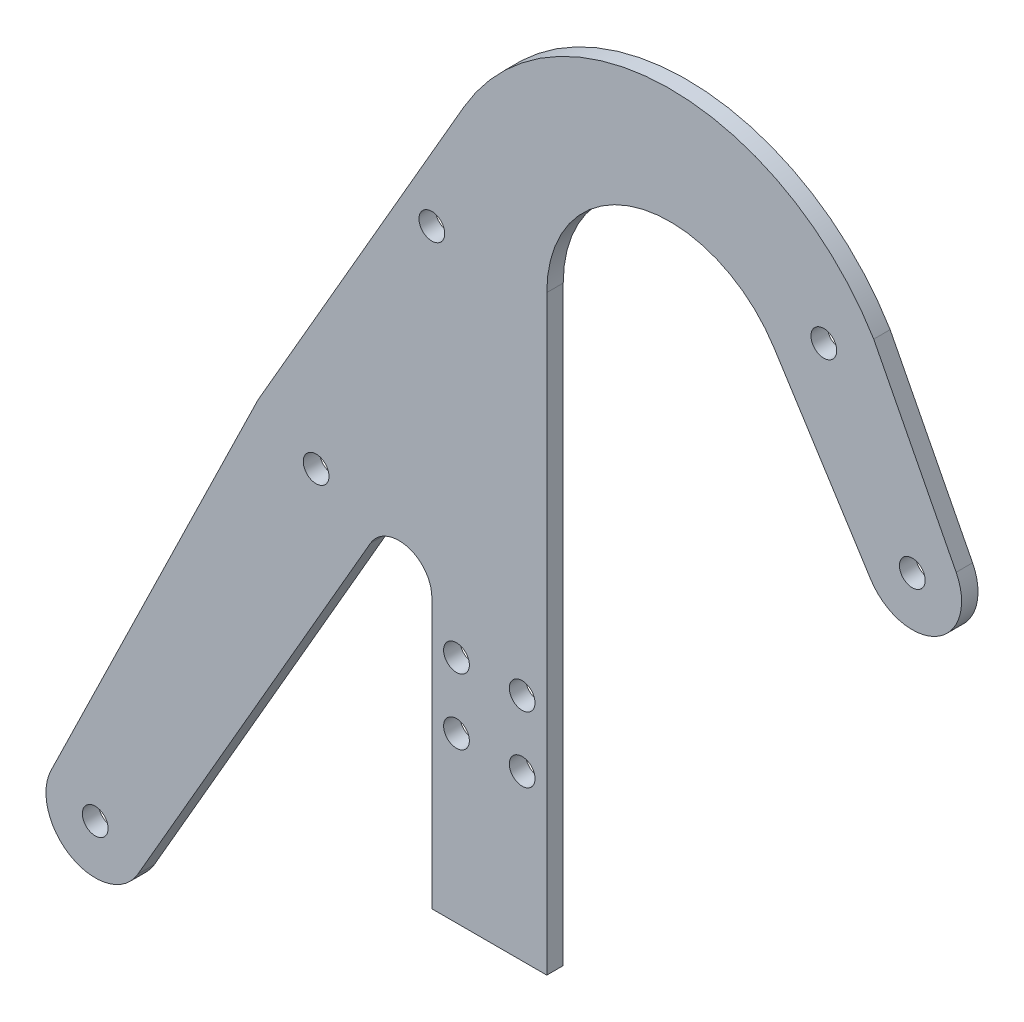
ISO-10303-21;
HEADER;
FILE_DESCRIPTION(('STEP AP214'),'2;1');
FILE_NAME('part.step','',(''),(''),'','','');
FILE_SCHEMA(('AUTOMOTIVE_DESIGN { 1 0 10303 214 1 1 1 1 }'));
ENDSEC;
DATA;
#1=APPLICATION_CONTEXT('core data for automotive mechanical design processes');
#2=APPLICATION_PROTOCOL_DEFINITION('international standard','automotive_design',2000,#1);
#3=PRODUCT_CONTEXT('',#1,'mechanical');
#4=PRODUCT('Part','Part','',(#3));
#5=PRODUCT_RELATED_PRODUCT_CATEGORY('part','',(#4));
#6=PRODUCT_DEFINITION_FORMATION('','',#4);
#7=PRODUCT_DEFINITION_CONTEXT('part definition',#1,'design');
#8=PRODUCT_DEFINITION('design','',#6,#7);
#9=PRODUCT_DEFINITION_SHAPE('','',#8);
#10=(LENGTH_UNIT() NAMED_UNIT(*) SI_UNIT(.MILLI.,.METRE.));
#11=(NAMED_UNIT(*) PLANE_ANGLE_UNIT() SI_UNIT($,.RADIAN.));
#12=(NAMED_UNIT(*) SI_UNIT($,.STERADIAN.) SOLID_ANGLE_UNIT());
#13=UNCERTAINTY_MEASURE_WITH_UNIT(LENGTH_MEASURE(1.E-05),#10,'distance_accuracy_value','');
#14=(GEOMETRIC_REPRESENTATION_CONTEXT(3) GLOBAL_UNCERTAINTY_ASSIGNED_CONTEXT((#13)) GLOBAL_UNIT_ASSIGNED_CONTEXT((#10,
#11,#12)) REPRESENTATION_CONTEXT('',''));
#15=CARTESIAN_POINT('',(0.,0.,0.));
#16=DIRECTION('',(0.,0.,1.));
#17=DIRECTION('',(1.,0.,0.));
#18=AXIS2_PLACEMENT_3D('',#15,#16,#17);
#19=CARTESIAN_POINT('',(-399.047531915002,194.628485701719,-3.175));
#20=DIRECTION('',(-0.89879404629917,0.438371146789071,0.));
#21=DIRECTION('',(-0.438371146789071,-0.89879404629917,0.));
#22=AXIS2_PLACEMENT_3D('',#19,#20,#21);
#23=PLANE('',#22);
#24=DIRECTION('',(-0.438371146789071,-0.89879404629917,0.));
#25=VECTOR('',#24,1.);
#26=CARTESIAN_POINT('',(-399.047531915002,194.628485701719,0.));
#27=LINE('',#26,#25);
#28=CARTESIAN_POINT('',(-19.5042629583881,972.807508089043,0.));
#29=VERTEX_POINT('',#28);
#30=CARTESIAN_POINT('',(-59.3610132909995,891.089059769221,0.));
#31=VERTEX_POINT('',#30);
#32=EDGE_CURVE('E225',#29,#31,#27,.T.);
#33=ORIENTED_EDGE('',*,*,#32,.F.);
#34=DIRECTION('',(0.,0.,1.));
#35=VECTOR('',#34,1.);
#36=CARTESIAN_POINT('',(-19.5042629583881,972.807508089043,-3.175));
#37=LINE('',#36,#35);
#38=CARTESIAN_POINT('',(-19.5042629583881,972.807508089043,-3.175));
#39=VERTEX_POINT('',#38);
#40=EDGE_CURVE('E164',#39,#29,#37,.T.);
#41=ORIENTED_EDGE('',*,*,#40,.F.);
#42=DIRECTION('',(-0.438371146789071,-0.89879404629917,0.));
#43=VECTOR('',#42,1.);
#44=CARTESIAN_POINT('',(-399.047531915002,194.628485701719,-3.175));
#45=LINE('',#44,#43);
#46=CARTESIAN_POINT('',(-59.3610132909995,891.089059769221,-3.175));
#47=VERTEX_POINT('',#46);
#48=EDGE_CURVE('E158',#39,#47,#45,.T.);
#49=ORIENTED_EDGE('',*,*,#48,.T.);
#50=DIRECTION('',(0.,0.,1.));
#51=VECTOR('',#50,1.);
#52=CARTESIAN_POINT('',(-59.3610132909995,891.089059769221,-3.175));
#53=LINE('',#52,#51);
#54=EDGE_CURVE('E140',#47,#31,#53,.T.);
#55=ORIENTED_EDGE('',*,*,#54,.T.);
#56=EDGE_LOOP('',(#33,#41,#49,#55));
#57=FACE_BOUND('',#56,.T.);
#58=ADVANCED_FACE('F39',(#57),#23,.T.);
#59=CARTESIAN_POINT('',(-8.08957857038857,967.240194524822,-3.175));
#60=DIRECTION('',(0.,0.,1.));
#61=DIRECTION('',(1.,0.,0.));
#62=AXIS2_PLACEMENT_3D('',#59,#60,#61);
#63=CYLINDRICAL_SURFACE('',#62,12.7000000000001);
#64=CARTESIAN_POINT('',(-8.08957857038857,967.240194524822,0.));
#65=DIRECTION('',(0.,0.,1.));
#66=DIRECTION('',(1.,0.,0.));
#67=AXIS2_PLACEMENT_3D('',#64,#65,#66);
#68=CIRCLE('',#67,12.7000000000001);
#69=CARTESIAN_POINT('',(-19.088101198451,973.590194524821,0.));
#70=VERTEX_POINT('',#69);
#71=EDGE_CURVE('E256',#70,#29,#68,.T.);
#72=ORIENTED_EDGE('',*,*,#71,.F.);
#73=DIRECTION('',(0.,0.,1.));
#74=VECTOR('',#73,1.);
#75=CARTESIAN_POINT('',(-19.088101198451,973.590194524821,-3.175));
#76=LINE('',#75,#74);
#77=CARTESIAN_POINT('',(-19.088101198451,973.590194524821,-3.175));
#78=VERTEX_POINT('',#77);
#79=EDGE_CURVE('E262',#78,#70,#76,.T.);
#80=ORIENTED_EDGE('',*,*,#79,.F.);
#81=CARTESIAN_POINT('',(-8.08957857038857,967.240194524822,-3.175));
#82=DIRECTION('',(0.,0.,1.));
#83=DIRECTION('',(1.,0.,0.));
#84=AXIS2_PLACEMENT_3D('',#81,#82,#83);
#85=CIRCLE('',#84,12.7000000000001);
#86=EDGE_CURVE('E152',#78,#39,#85,.T.);
#87=ORIENTED_EDGE('',*,*,#86,.T.);
#88=ORIENTED_EDGE('',*,*,#40,.T.);
#89=EDGE_LOOP('',(#72,#80,#87,#88));
#90=FACE_BOUND('',#89,.T.);
#91=ADVANCED_FACE('F292',(#90),#63,.T.);
#92=CARTESIAN_POINT('',(-435.8929965658,251.662938905133,-3.175));
#93=DIRECTION('',(-0.866025403784442,0.499999999999995,0.));
#94=DIRECTION('',(-0.499999999999995,-0.866025403784442,0.));
#95=AXIS2_PLACEMENT_3D('',#92,#93,#94);
#96=PLANE('',#95);
#97=DIRECTION('',(-0.499999999999995,-0.866025403784442,0.));
#98=VECTOR('',#97,1.);
#99=CARTESIAN_POINT('',(-435.8929965658,251.662938905133,0.));
#100=LINE('',#99,#98);
#101=CARTESIAN_POINT('',(20.4553554732739,1042.08147058715,0.));
#102=VERTEX_POINT('',#101);
#103=EDGE_CURVE('E253',#102,#70,#100,.T.);
#104=ORIENTED_EDGE('',*,*,#103,.F.);
#105=DIRECTION('',(0.,0.,1.));
#106=VECTOR('',#105,1.);
#107=CARTESIAN_POINT('',(20.4553554732739,1042.08147058715,-3.175));
#108=LINE('',#107,#106);
#109=CARTESIAN_POINT('',(20.4553554732739,1042.08147058715,-3.175));
#110=VERTEX_POINT('',#109);
#111=EDGE_CURVE('E264',#110,#102,#108,.T.);
#112=ORIENTED_EDGE('',*,*,#111,.F.);
#113=DIRECTION('',(-0.499999999999995,-0.866025403784442,0.));
#114=VECTOR('',#113,1.);
#115=CARTESIAN_POINT('',(-435.8929965658,251.662938905133,-3.175));
#116=LINE('',#115,#114);
#117=EDGE_CURVE('E194',#110,#78,#116,.T.);
#118=ORIENTED_EDGE('',*,*,#117,.T.);
#119=ORIENTED_EDGE('',*,*,#79,.T.);
#120=EDGE_LOOP('',(#104,#112,#118,#119));
#121=FACE_BOUND('',#120,.T.);
#122=ADVANCED_FACE('F335',(#121),#96,.T.);
#123=CARTESIAN_POINT('',(60.3250000000002,1019.06272058715,-3.175));
#124=DIRECTION('',(0.,0.,1.));
#125=DIRECTION('',(1.,0.,0.));
#126=AXIS2_PLACEMENT_3D('',#123,#124,#125);
#127=CYLINDRICAL_SURFACE('',#126,46.0375000000001);
#128=CARTESIAN_POINT('',(60.3250000000002,1019.06272058715,0.));
#129=DIRECTION('',(0.,0.,1.));
#130=DIRECTION('',(1.,0.,0.));
#131=AXIS2_PLACEMENT_3D('',#128,#129,#130);
#132=CIRCLE('',#131,46.0375000000001);
#133=CARTESIAN_POINT('',(99.7257138260212,1042.87522058715,0.));
#134=VERTEX_POINT('',#133);
#135=EDGE_CURVE('E250',#134,#102,#132,.T.);
#136=ORIENTED_EDGE('',*,*,#135,.F.);
#137=DIRECTION('',(0.,0.,1.));
#138=VECTOR('',#137,1.);
#139=CARTESIAN_POINT('',(99.7257138260212,1042.87522058715,-3.175));
#140=LINE('',#139,#138);
#141=CARTESIAN_POINT('',(99.7257138260212,1042.87522058715,-3.175));
#142=VERTEX_POINT('',#141);
#143=EDGE_CURVE('E266',#142,#134,#140,.T.);
#144=ORIENTED_EDGE('',*,*,#143,.F.);
#145=CARTESIAN_POINT('',(60.3250000000002,1019.06272058715,-3.175));
#146=DIRECTION('',(0.,0.,1.));
#147=DIRECTION('',(1.,0.,0.));
#148=AXIS2_PLACEMENT_3D('',#145,#146,#147);
#149=CIRCLE('',#148,46.0375000000001);
#150=EDGE_CURVE('E191',#142,#110,#149,.T.);
#151=ORIENTED_EDGE('',*,*,#150,.T.);
#152=ORIENTED_EDGE('',*,*,#111,.T.);
#153=EDGE_LOOP('',(#136,#144,#151,#152));
#154=FACE_BOUND('',#153,.T.);
#155=ADVANCED_FACE('F298',(#154),#127,.T.);
#156=CARTESIAN_POINT('',(502.455000504294,257.725954336452,-3.175));
#157=DIRECTION('',(-0.889776673115529,-0.456396178752037,0.));
#158=DIRECTION('',(0.456396178752037,-0.889776673115529,0.));
#159=AXIS2_PLACEMENT_3D('',#156,#157,#158);
#160=PLANE('',#159);
#161=DIRECTION('',(0.456396178752037,-0.889776673115529,0.));
#162=VECTOR('',#161,1.);
#163=CARTESIAN_POINT('',(502.455000504294,257.725954336452,0.));
#164=LINE('',#163,#162);
#165=CARTESIAN_POINT('',(115.665350368936,1011.79977027859,0.));
#166=VERTEX_POINT('',#165);
#167=EDGE_CURVE('E247',#134,#166,#164,.T.);
#168=ORIENTED_EDGE('',*,*,#167,.T.);
#169=DIRECTION('',(0.,0.,1.));
#170=VECTOR('',#169,1.);
#171=CARTESIAN_POINT('',(115.665350368936,1011.79977027859,-3.175));
#172=LINE('',#171,#170);
#173=CARTESIAN_POINT('',(115.665350368936,1011.79977027859,-3.175));
#174=VERTEX_POINT('',#173);
#175=EDGE_CURVE('E268',#174,#166,#172,.T.);
#176=ORIENTED_EDGE('',*,*,#175,.F.);
#177=DIRECTION('',(0.456396178752037,-0.889776673115529,0.));
#178=VECTOR('',#177,1.);
#179=CARTESIAN_POINT('',(502.455000504294,257.725954336452,-3.175));
#180=LINE('',#179,#178);
#181=EDGE_CURVE('E189',#142,#174,#180,.T.);
#182=ORIENTED_EDGE('',*,*,#181,.F.);
#183=ORIENTED_EDGE('',*,*,#143,.T.);
#184=EDGE_LOOP('',(#168,#176,#182,#183));
#185=FACE_BOUND('',#184,.T.);
#186=ADVANCED_FACE('F303',(#185),#160,.F.);
#187=CARTESIAN_POINT('',(107.190227557511,1007.45259667598,-3.175));
#188=DIRECTION('',(0.,0.,1.));
#189=DIRECTION('',(1.,0.,0.));
#190=AXIS2_PLACEMENT_3D('',#187,#188,#189);
#191=CYLINDRICAL_SURFACE('',#190,9.52500000000022);
#192=CARTESIAN_POINT('',(107.190227557511,1007.45259667598,0.));
#193=DIRECTION('',(0.,0.,1.));
#194=DIRECTION('',(1.,0.,0.));
#195=AXIS2_PLACEMENT_3D('',#192,#193,#194);
#196=CIRCLE('',#195,9.52500000000022);
#197=CARTESIAN_POINT('',(99.1496275266768,1002.34628918972,0.));
#198=VERTEX_POINT('',#197);
#199=EDGE_CURVE('E244',#198,#166,#196,.T.);
#200=ORIENTED_EDGE('',*,*,#199,.F.);
#201=DIRECTION('',(0.,0.,1.));
#202=VECTOR('',#201,1.);
#203=CARTESIAN_POINT('',(99.1496275266768,1002.34628918972,-3.175));
#204=LINE('',#203,#202);
#205=CARTESIAN_POINT('',(99.1496275266768,1002.34628918972,-3.175));
#206=VERTEX_POINT('',#205);
#207=EDGE_CURVE('E270',#206,#198,#204,.T.);
#208=ORIENTED_EDGE('',*,*,#207,.F.);
#209=CARTESIAN_POINT('',(107.190227557511,1007.45259667598,-3.175));
#210=DIRECTION('',(0.,0.,1.));
#211=DIRECTION('',(1.,0.,0.));
#212=AXIS2_PLACEMENT_3D('',#209,#210,#211);
#213=CIRCLE('',#212,9.52500000000022);
#214=EDGE_CURVE('E186',#206,#174,#213,.T.);
#215=ORIENTED_EDGE('',*,*,#214,.T.);
#216=ORIENTED_EDGE('',*,*,#175,.T.);
#217=EDGE_LOOP('',(#200,#208,#215,#216));
#218=FACE_BOUND('',#217,.T.);
#219=ADVANCED_FACE('F442',(#218),#191,.T.);
#220=CARTESIAN_POINT('',(524.264856713745,332.942510801512,-3.175));
#221=DIRECTION('',(-0.84415748355209,-0.536095274147239,0.));
#222=DIRECTION('',(0.536095274147239,-0.84415748355209,0.));
#223=AXIS2_PLACEMENT_3D('',#220,#221,#222);
#224=PLANE('',#223);
#225=DIRECTION('',(0.536095274147239,-0.84415748355209,0.));
#226=VECTOR('',#225,1.);
#227=CARTESIAN_POINT('',(524.264856713745,332.942510801512,0.));
#228=LINE('',#227,#226);
#229=CARTESIAN_POINT('',(80.4265000770844,1031.82848930278,0.));
#230=VERTEX_POINT('',#229);
#231=EDGE_CURVE('E241',#230,#198,#228,.T.);
#232=ORIENTED_EDGE('',*,*,#231,.F.);
#233=DIRECTION('',(0.,0.,1.));
#234=VECTOR('',#233,1.);
#235=CARTESIAN_POINT('',(80.4265000770844,1031.82848930278,-3.175));
#236=LINE('',#235,#234);
#237=CARTESIAN_POINT('',(80.4265000770844,1031.82848930278,-3.175));
#238=VERTEX_POINT('',#237);
#239=EDGE_CURVE('E272',#238,#230,#236,.T.);
#240=ORIENTED_EDGE('',*,*,#239,.F.);
#241=DIRECTION('',(0.536095274147239,-0.84415748355209,0.));
#242=VECTOR('',#241,1.);
#243=CARTESIAN_POINT('',(524.264856713745,332.942510801512,-3.175));
#244=LINE('',#243,#242);
#245=EDGE_CURVE('E183',#238,#206,#244,.T.);
#246=ORIENTED_EDGE('',*,*,#245,.T.);
#247=ORIENTED_EDGE('',*,*,#207,.T.);
#248=EDGE_LOOP('',(#232,#240,#246,#247));
#249=FACE_BOUND('',#248,.T.);
#250=ADVANCED_FACE('F309',(#249),#224,.T.);
#251=CARTESIAN_POINT('',(60.3250000000002,1019.06272058715,-3.175));
#252=DIRECTION('',(0.,0.,1.));
#253=DIRECTION('',(1.,0.,0.));
#254=AXIS2_PLACEMENT_3D('',#251,#252,#253);
#255=CYLINDRICAL_SURFACE('',#254,23.8125);
#256=CARTESIAN_POINT('',(60.3250000000002,1019.06272058715,0.));
#257=DIRECTION('',(0.,0.,1.));
#258=DIRECTION('',(1.,0.,0.));
#259=AXIS2_PLACEMENT_3D('',#256,#257,#258);
#260=CIRCLE('',#259,23.8125);
#261=CARTESIAN_POINT('',(36.5125000000002,1019.06272058715,0.));
#262=VERTEX_POINT('',#261);
#263=EDGE_CURVE('E238',#230,#262,#260,.T.);
#264=ORIENTED_EDGE('',*,*,#263,.T.);
#265=DIRECTION('',(0.,0.,1.));
#266=VECTOR('',#265,1.);
#267=CARTESIAN_POINT('',(36.5125000000002,1019.06272058715,-3.175));
#268=LINE('',#267,#266);
#269=CARTESIAN_POINT('',(36.5125000000002,1019.06272058715,-3.175));
#270=VERTEX_POINT('',#269);
#271=EDGE_CURVE('E274',#270,#262,#268,.T.);
#272=ORIENTED_EDGE('',*,*,#271,.F.);
#273=CARTESIAN_POINT('',(60.3250000000002,1019.06272058715,-3.175));
#274=DIRECTION('',(0.,0.,1.));
#275=DIRECTION('',(1.,0.,0.));
#276=AXIS2_PLACEMENT_3D('',#273,#274,#275);
#277=CIRCLE('',#276,23.8125);
#278=EDGE_CURVE('E181',#238,#270,#277,.T.);
#279=ORIENTED_EDGE('',*,*,#278,.F.);
#280=ORIENTED_EDGE('',*,*,#239,.T.);
#281=EDGE_LOOP('',(#264,#272,#279,#280));
#282=FACE_BOUND('',#281,.T.);
#283=ADVANCED_FACE('F315',(#282),#255,.F.);
#284=CARTESIAN_POINT('',(36.5124999999994,0.,-3.175));
#285=DIRECTION('',(1.,0.,0.));
#286=DIRECTION('',(0.,1.,0.));
#287=AXIS2_PLACEMENT_3D('',#284,#285,#286);
#288=PLANE('',#287);
#289=DIRECTION('',(0.,1.,0.));
#290=VECTOR('',#289,1.);
#291=CARTESIAN_POINT('',(36.5124999999994,0.,0.));
#292=LINE('',#291,#290);
#293=CARTESIAN_POINT('',(36.5125000000001,904.762720587149,0.));
#294=VERTEX_POINT('',#293);
#295=EDGE_CURVE('E235',#294,#262,#292,.T.);
#296=ORIENTED_EDGE('',*,*,#295,.F.);
#297=DIRECTION('',(0.,0.,1.));
#298=VECTOR('',#297,1.);
#299=CARTESIAN_POINT('',(36.5125000000001,904.762720587149,-3.175));
#300=LINE('',#299,#298);
#301=CARTESIAN_POINT('',(36.5125000000001,904.762720587149,-3.175));
#302=VERTEX_POINT('',#301);
#303=EDGE_CURVE('E276',#302,#294,#300,.T.);
#304=ORIENTED_EDGE('',*,*,#303,.F.);
#305=DIRECTION('',(0.,1.,0.));
#306=VECTOR('',#305,1.);
#307=CARTESIAN_POINT('',(36.5124999999994,0.,-3.175));
#308=LINE('',#307,#306);
#309=EDGE_CURVE('E178',#302,#270,#308,.T.);
#310=ORIENTED_EDGE('',*,*,#309,.T.);
#311=ORIENTED_EDGE('',*,*,#271,.T.);
#312=EDGE_LOOP('',(#296,#304,#310,#311));
#313=FACE_BOUND('',#312,.T.);
#314=ADVANCED_FACE('F449',(#313),#288,.T.);
#315=CARTESIAN_POINT('',(0.,904.762720587149,-3.175));
#316=DIRECTION('',(0.,-1.,0.));
#317=DIRECTION('',(0.,0.,-1.));
#318=AXIS2_PLACEMENT_3D('',#315,#316,#317);
#319=PLANE('',#318);
#320=DIRECTION('',(1.,0.,0.));
#321=VECTOR('',#320,1.);
#322=CARTESIAN_POINT('',(0.,904.762720587149,0.));
#323=LINE('',#322,#321);
#324=CARTESIAN_POINT('',(14.2875000000001,904.762720587149,0.));
#325=VERTEX_POINT('',#324);
#326=EDGE_CURVE('E232',#325,#294,#323,.T.);
#327=ORIENTED_EDGE('',*,*,#326,.F.);
#328=DIRECTION('',(0.,0.,1.));
#329=VECTOR('',#328,1.);
#330=CARTESIAN_POINT('',(14.2875000000001,904.762720587149,-3.175));
#331=LINE('',#330,#329);
#332=CARTESIAN_POINT('',(14.2875000000001,904.762720587149,-3.175));
#333=VERTEX_POINT('',#332);
#334=EDGE_CURVE('E278',#333,#325,#331,.T.);
#335=ORIENTED_EDGE('',*,*,#334,.F.);
#336=DIRECTION('',(1.,0.,0.));
#337=VECTOR('',#336,1.);
#338=CARTESIAN_POINT('',(0.,904.762720587149,-3.175));
#339=LINE('',#338,#337);
#340=EDGE_CURVE('E175',#333,#302,#339,.T.);
#341=ORIENTED_EDGE('',*,*,#340,.T.);
#342=ORIENTED_EDGE('',*,*,#303,.T.);
#343=EDGE_LOOP('',(#327,#335,#341,#342));
#344=FACE_BOUND('',#343,.T.);
#345=ADVANCED_FACE('F321',(#344),#319,.T.);
#346=CARTESIAN_POINT('',(14.2875000000001,0.,-3.175));
#347=DIRECTION('',(1.,0.,0.));
#348=DIRECTION('',(0.,0.,-1.));
#349=AXIS2_PLACEMENT_3D('',#346,#347,#348);
#350=PLANE('',#349);
#351=DIRECTION('',(0.,1.,0.));
#352=VECTOR('',#351,1.);
#353=CARTESIAN_POINT('',(14.2875000000001,0.,0.));
#354=LINE('',#353,#352);
#355=CARTESIAN_POINT('',(14.2875000000001,956.899908905633,0.));
#356=VERTEX_POINT('',#355);
#357=EDGE_CURVE('E230',#325,#356,#354,.T.);
#358=ORIENTED_EDGE('',*,*,#357,.T.);
#359=DIRECTION('',(0.,0.,1.));
#360=VECTOR('',#359,1.);
#361=CARTESIAN_POINT('',(14.2875000000001,956.899908905633,-3.175));
#362=LINE('',#361,#360);
#363=CARTESIAN_POINT('',(14.2875000000001,956.899908905633,-3.175));
#364=VERTEX_POINT('',#363);
#365=EDGE_CURVE('E54',#356,#364,#362,.F.);
#366=ORIENTED_EDGE('',*,*,#365,.T.);
#367=DIRECTION('',(0.,1.,0.));
#368=VECTOR('',#367,1.);
#369=CARTESIAN_POINT('',(14.2875000000001,0.,-3.175));
#370=LINE('',#369,#368);
#371=EDGE_CURVE('E173',#333,#364,#370,.T.);
#372=ORIENTED_EDGE('',*,*,#371,.F.);
#373=ORIENTED_EDGE('',*,*,#334,.T.);
#374=EDGE_LOOP('',(#358,#366,#372,#373));
#375=FACE_BOUND('',#374,.T.);
#376=ADVANCED_FACE('F323',(#375),#350,.F.);
#377=CARTESIAN_POINT('',(-413.895951309675,238.962938905133,-3.175));
#378=DIRECTION('',(-0.866025403784442,0.499999999999994,0.));
#379=DIRECTION('',(-0.499999999999995,-0.866025403784442,0.));
#380=AXIS2_PLACEMENT_3D('',#377,#378,#379);
#381=PLANE('',#380);
#382=DIRECTION('',(-0.499999999999994,-0.866025403784442,0.));
#383=VECTOR('',#382,1.);
#384=CARTESIAN_POINT('',(-413.895951309675,238.962938905133,-3.175));
#385=LINE('',#384,#383);
#386=CARTESIAN_POINT('',(2.43823868596887,960.074908905633,-3.175));
#387=VERTEX_POINT('',#386);
#388=CARTESIAN_POINT('',(-42.551108028953,882.151074596055,-3.175));
#389=VERTEX_POINT('',#388);
#390=EDGE_CURVE('E161',#387,#389,#385,.T.);
#391=ORIENTED_EDGE('',*,*,#390,.F.);
#392=DIRECTION('',(0.,0.,1.));
#393=VECTOR('',#392,1.);
#394=CARTESIAN_POINT('',(2.43823868596882,960.074908905633,0.));
#395=LINE('',#394,#393);
#396=CARTESIAN_POINT('',(2.43823868596887,960.074908905633,0.));
#397=VERTEX_POINT('',#396);
#398=EDGE_CURVE('E261',#387,#397,#395,.T.);
#399=ORIENTED_EDGE('',*,*,#398,.T.);
#400=DIRECTION('',(-0.499999999999994,-0.866025403784442,0.));
#401=VECTOR('',#400,1.);
#402=CARTESIAN_POINT('',(-413.895951309675,238.962938905133,0.));
#403=LINE('',#402,#401);
#404=CARTESIAN_POINT('',(-42.551108028953,882.151074596055,0.));
#405=VERTEX_POINT('',#404);
#406=EDGE_CURVE('E228',#397,#405,#403,.T.);
#407=ORIENTED_EDGE('',*,*,#406,.T.);
#408=DIRECTION('',(0.,0.,1.));
#409=VECTOR('',#408,1.);
#410=CARTESIAN_POINT('',(-42.551108028953,882.151074596055,-3.175));
#411=LINE('',#410,#409);
#412=EDGE_CURVE('E151',#389,#405,#411,.T.);
#413=ORIENTED_EDGE('',*,*,#412,.F.);
#414=EDGE_LOOP('',(#391,#399,#407,#413));
#415=FACE_BOUND('',#414,.T.);
#416=ADVANCED_FACE('F285',(#415),#381,.F.);
#417=CARTESIAN_POINT('',(-8.08957857038857,967.240194524822,-3.175));
#418=DIRECTION('',(0.,0.,1.));
#419=DIRECTION('',(1.,0.,0.));
#420=AXIS2_PLACEMENT_3D('',#417,#418,#419);
#421=CYLINDRICAL_SURFACE('',#420,2.48919999999975);
#422=CARTESIAN_POINT('',(-8.08957857038857,967.240194524822,-3.175));
#423=DIRECTION('',(0.,0.,1.));
#424=DIRECTION('',(1.,0.,0.));
#425=AXIS2_PLACEMENT_3D('',#422,#423,#424);
#426=CIRCLE('',#425,2.48919999999975);
#427=CARTESIAN_POINT('',(-5.60037857038882,967.240194524822,-3.175));
#428=VERTEX_POINT('',#427);
#429=EDGE_CURVE('E165',#428,#428,#426,.T.);
#430=ORIENTED_EDGE('',*,*,#429,.F.);
#431=EDGE_LOOP('',(#430));
#432=FACE_BOUND('',#431,.T.);
#433=CARTESIAN_POINT('',(-8.08957857038857,967.240194524822,0.));
#434=DIRECTION('',(0.,0.,1.));
#435=DIRECTION('',(1.,0.,0.));
#436=AXIS2_PLACEMENT_3D('',#433,#434,#435);
#437=CIRCLE('',#436,2.48919999999975);
#438=CARTESIAN_POINT('',(-5.60037857038882,967.240194524822,0.));
#439=VERTEX_POINT('',#438);
#440=EDGE_CURVE('E222',#439,#439,#437,.T.);
#441=ORIENTED_EDGE('',*,*,#440,.T.);
#442=EDGE_LOOP('',(#441));
#443=FACE_BOUND('',#442,.T.);
#444=ADVANCED_FACE('F340',(#432,#443),#421,.F.);
#445=CARTESIAN_POINT('',(14.2875000000001,1019.06272058715,-3.175));
#446=DIRECTION('',(0.,0.,1.));
#447=DIRECTION('',(1.,0.,0.));
#448=AXIS2_PLACEMENT_3D('',#445,#446,#447);
#449=CYLINDRICAL_SURFACE('',#448,2.48920000000006);
#450=CARTESIAN_POINT('',(14.2875000000001,1019.06272058715,-3.175));
#451=DIRECTION('',(0.,0.,1.));
#452=DIRECTION('',(1.,0.,0.));
#453=AXIS2_PLACEMENT_3D('',#450,#451,#452);
#454=CIRCLE('',#453,2.48920000000006);
#455=CARTESIAN_POINT('',(16.7767000000002,1019.06272058715,-3.175));
#456=VERTEX_POINT('',#455);
#457=EDGE_CURVE('E168',#456,#456,#454,.T.);
#458=ORIENTED_EDGE('',*,*,#457,.F.);
#459=EDGE_LOOP('',(#458));
#460=FACE_BOUND('',#459,.T.);
#461=CARTESIAN_POINT('',(14.2875000000001,1019.06272058715,0.));
#462=DIRECTION('',(0.,0.,1.));
#463=DIRECTION('',(1.,0.,0.));
#464=AXIS2_PLACEMENT_3D('',#461,#462,#463);
#465=CIRCLE('',#464,2.48920000000006);
#466=CARTESIAN_POINT('',(16.7767000000002,1019.06272058715,0.));
#467=VERTEX_POINT('',#466);
#468=EDGE_CURVE('E219',#467,#467,#465,.T.);
#469=ORIENTED_EDGE('',*,*,#468,.T.);
#470=EDGE_LOOP('',(#469));
#471=FACE_BOUND('',#470,.T.);
#472=ADVANCED_FACE('F343',(#460,#471),#449,.F.);
#473=CARTESIAN_POINT('',(90.0761069515527,1037.35185494496,-3.175));
#474=DIRECTION('',(0.,0.,1.));
#475=DIRECTION('',(1.,0.,0.));
#476=AXIS2_PLACEMENT_3D('',#473,#474,#475);
#477=CYLINDRICAL_SURFACE('',#476,2.48920000000008);
#478=CARTESIAN_POINT('',(90.0761069515527,1037.35185494496,-3.175));
#479=DIRECTION('',(0.,0.,1.));
#480=DIRECTION('',(1.,0.,0.));
#481=AXIS2_PLACEMENT_3D('',#478,#479,#480);
#482=CIRCLE('',#481,2.48920000000008);
#483=CARTESIAN_POINT('',(92.5653069515528,1037.35185494496,-3.175));
#484=VERTEX_POINT('',#483);
#485=EDGE_CURVE('E423',#484,#484,#482,.T.);
#486=ORIENTED_EDGE('',*,*,#485,.F.);
#487=EDGE_LOOP('',(#486));
#488=FACE_BOUND('',#487,.T.);
#489=CARTESIAN_POINT('',(90.0761069515527,1037.35185494496,0.));
#490=DIRECTION('',(0.,0.,1.));
#491=DIRECTION('',(1.,0.,0.));
#492=AXIS2_PLACEMENT_3D('',#489,#490,#491);
#493=CIRCLE('',#492,2.48920000000008);
#494=CARTESIAN_POINT('',(92.5653069515528,1037.35185494496,0.));
#495=VERTEX_POINT('',#494);
#496=EDGE_CURVE('E216',#495,#495,#493,.T.);
#497=ORIENTED_EDGE('',*,*,#496,.T.);
#498=EDGE_LOOP('',(#497));
#499=FACE_BOUND('',#498,.T.);
#500=ADVANCED_FACE('F347',(#488,#499),#477,.F.);
#501=CARTESIAN_POINT('',(107.190227557511,1007.45259667598,-3.175));
#502=DIRECTION('',(0.,0.,1.));
#503=DIRECTION('',(1.,0.,0.));
#504=AXIS2_PLACEMENT_3D('',#501,#502,#503);
#505=CYLINDRICAL_SURFACE('',#504,2.48920000000002);
#506=CARTESIAN_POINT('',(107.190227557511,1007.45259667598,-3.175));
#507=DIRECTION('',(0.,0.,1.));
#508=DIRECTION('',(1.,0.,0.));
#509=AXIS2_PLACEMENT_3D('',#506,#507,#508);
#510=CIRCLE('',#509,2.48920000000002);
#511=CARTESIAN_POINT('',(109.679427557511,1007.45259667598,-3.175));
#512=VERTEX_POINT('',#511);
#513=EDGE_CURVE('E420',#512,#512,#510,.T.);
#514=ORIENTED_EDGE('',*,*,#513,.F.);
#515=EDGE_LOOP('',(#514));
#516=FACE_BOUND('',#515,.T.);
#517=CARTESIAN_POINT('',(107.190227557511,1007.45259667598,0.));
#518=DIRECTION('',(0.,0.,1.));
#519=DIRECTION('',(1.,0.,0.));
#520=AXIS2_PLACEMENT_3D('',#517,#518,#519);
#521=CIRCLE('',#520,2.48920000000002);
#522=CARTESIAN_POINT('',(109.679427557511,1007.45259667598,0.));
#523=VERTEX_POINT('',#522);
#524=EDGE_CURVE('E213',#523,#523,#521,.T.);
#525=ORIENTED_EDGE('',*,*,#524,.T.);
#526=EDGE_LOOP('',(#525));
#527=FACE_BOUND('',#526,.T.);
#528=ADVANCED_FACE('F351',(#516,#527),#505,.F.);
#529=CARTESIAN_POINT('',(-50.8,886.913574596055,-3.175));
#530=DIRECTION('',(0.,0.,1.));
#531=DIRECTION('',(1.,0.,0.));
#532=AXIS2_PLACEMENT_3D('',#529,#530,#531);
#533=CYLINDRICAL_SURFACE('',#532,2.48919999999982);
#534=CARTESIAN_POINT('',(-50.8,886.913574596055,-3.175));
#535=DIRECTION('',(0.,0.,1.));
#536=DIRECTION('',(1.,0.,0.));
#537=AXIS2_PLACEMENT_3D('',#534,#535,#536);
#538=CIRCLE('',#537,2.48919999999982);
#539=CARTESIAN_POINT('',(-48.3108000000002,886.913574596055,-3.175));
#540=VERTEX_POINT('',#539);
#541=EDGE_CURVE('E417',#540,#540,#538,.T.);
#542=ORIENTED_EDGE('',*,*,#541,.F.);
#543=EDGE_LOOP('',(#542));
#544=FACE_BOUND('',#543,.T.);
#545=CARTESIAN_POINT('',(-50.8,886.913574596055,0.));
#546=DIRECTION('',(0.,0.,1.));
#547=DIRECTION('',(1.,0.,0.));
#548=AXIS2_PLACEMENT_3D('',#545,#546,#547);
#549=CIRCLE('',#548,2.48919999999982);
#550=CARTESIAN_POINT('',(-48.3108000000002,886.913574596055,0.));
#551=VERTEX_POINT('',#550);
#552=EDGE_CURVE('E210',#551,#551,#549,.T.);
#553=ORIENTED_EDGE('',*,*,#552,.T.);
#554=EDGE_LOOP('',(#553));
#555=FACE_BOUND('',#554,.T.);
#556=ADVANCED_FACE('F355',(#544,#555),#533,.F.);
#557=CARTESIAN_POINT('',(31.7500000000001,936.512720587149,-3.175));
#558=DIRECTION('',(0.,0.,1.));
#559=DIRECTION('',(1.,0.,0.));
#560=AXIS2_PLACEMENT_3D('',#557,#558,#559);
#561=CYLINDRICAL_SURFACE('',#560,2.48919999999991);
#562=CARTESIAN_POINT('',(31.7500000000001,936.512720587149,-3.175));
#563=DIRECTION('',(0.,0.,1.));
#564=DIRECTION('',(1.,0.,0.));
#565=AXIS2_PLACEMENT_3D('',#562,#563,#564);
#566=CIRCLE('',#565,2.48919999999991);
#567=CARTESIAN_POINT('',(34.2392,936.512720587149,-3.175));
#568=VERTEX_POINT('',#567);
#569=EDGE_CURVE('E414',#568,#568,#566,.T.);
#570=ORIENTED_EDGE('',*,*,#569,.F.);
#571=EDGE_LOOP('',(#570));
#572=FACE_BOUND('',#571,.T.);
#573=CARTESIAN_POINT('',(31.7500000000001,936.512720587149,0.));
#574=DIRECTION('',(0.,0.,1.));
#575=DIRECTION('',(1.,0.,0.));
#576=AXIS2_PLACEMENT_3D('',#573,#574,#575);
#577=CIRCLE('',#576,2.48919999999991);
#578=CARTESIAN_POINT('',(34.2392,936.512720587149,0.));
#579=VERTEX_POINT('',#578);
#580=EDGE_CURVE('E207',#579,#579,#577,.T.);
#581=ORIENTED_EDGE('',*,*,#580,.T.);
#582=EDGE_LOOP('',(#581));
#583=FACE_BOUND('',#582,.T.);
#584=ADVANCED_FACE('F359',(#572,#583),#561,.F.);
#585=CARTESIAN_POINT('',(31.7500000000001,949.212720587149,-3.175));
#586=DIRECTION('',(0.,0.,1.));
#587=DIRECTION('',(1.,0.,0.));
#588=AXIS2_PLACEMENT_3D('',#585,#586,#587);
#589=CYLINDRICAL_SURFACE('',#588,2.48919999999991);
#590=CARTESIAN_POINT('',(31.7500000000001,949.212720587149,-3.175));
#591=DIRECTION('',(0.,0.,1.));
#592=DIRECTION('',(1.,0.,0.));
#593=AXIS2_PLACEMENT_3D('',#590,#591,#592);
#594=CIRCLE('',#593,2.48919999999991);
#595=CARTESIAN_POINT('',(34.2392,949.212720587149,-3.175));
#596=VERTEX_POINT('',#595);
#597=EDGE_CURVE('E409',#596,#596,#594,.T.);
#598=ORIENTED_EDGE('',*,*,#597,.F.);
#599=EDGE_LOOP('',(#598));
#600=FACE_BOUND('',#599,.T.);
#601=CARTESIAN_POINT('',(31.7500000000001,949.212720587149,0.));
#602=DIRECTION('',(0.,0.,1.));
#603=DIRECTION('',(1.,0.,0.));
#604=AXIS2_PLACEMENT_3D('',#601,#602,#603);
#605=CIRCLE('',#604,2.48919999999991);
#606=CARTESIAN_POINT('',(34.2392,949.212720587149,0.));
#607=VERTEX_POINT('',#606);
#608=EDGE_CURVE('E204',#607,#607,#605,.T.);
#609=ORIENTED_EDGE('',*,*,#608,.T.);
#610=EDGE_LOOP('',(#609));
#611=FACE_BOUND('',#610,.T.);
#612=ADVANCED_FACE('F363',(#600,#611),#589,.F.);
#613=CARTESIAN_POINT('',(19.0500000000001,949.212720587149,-3.175));
#614=DIRECTION('',(0.,0.,1.));
#615=DIRECTION('',(1.,0.,0.));
#616=AXIS2_PLACEMENT_3D('',#613,#614,#615);
#617=CYLINDRICAL_SURFACE('',#616,2.48919999999989);
#618=CARTESIAN_POINT('',(19.0500000000001,949.212720587149,-3.175));
#619=DIRECTION('',(0.,0.,1.));
#620=DIRECTION('',(1.,0.,0.));
#621=AXIS2_PLACEMENT_3D('',#618,#619,#620);
#622=CIRCLE('',#621,2.48919999999989);
#623=CARTESIAN_POINT('',(21.5392,949.212720587149,-3.175));
#624=VERTEX_POINT('',#623);
#625=EDGE_CURVE('E406',#624,#624,#622,.T.);
#626=ORIENTED_EDGE('',*,*,#625,.F.);
#627=EDGE_LOOP('',(#626));
#628=FACE_BOUND('',#627,.T.);
#629=CARTESIAN_POINT('',(19.0500000000001,949.212720587149,0.));
#630=DIRECTION('',(0.,0.,1.));
#631=DIRECTION('',(1.,0.,0.));
#632=AXIS2_PLACEMENT_3D('',#629,#630,#631);
#633=CIRCLE('',#632,2.48919999999989);
#634=CARTESIAN_POINT('',(21.5392,949.212720587149,0.));
#635=VERTEX_POINT('',#634);
#636=EDGE_CURVE('E201',#635,#635,#633,.T.);
#637=ORIENTED_EDGE('',*,*,#636,.T.);
#638=EDGE_LOOP('',(#637));
#639=FACE_BOUND('',#638,.T.);
#640=ADVANCED_FACE('F367',(#628,#639),#617,.F.);
#641=CARTESIAN_POINT('',(19.0500000000001,936.512720587149,-3.175));
#642=DIRECTION('',(0.,0.,1.));
#643=DIRECTION('',(1.,0.,0.));
#644=AXIS2_PLACEMENT_3D('',#641,#642,#643);
#645=CYLINDRICAL_SURFACE('',#644,2.48919999999989);
#646=CARTESIAN_POINT('',(19.0500000000001,936.512720587149,-3.175));
#647=DIRECTION('',(0.,0.,1.));
#648=DIRECTION('',(1.,0.,0.));
#649=AXIS2_PLACEMENT_3D('',#646,#647,#648);
#650=CIRCLE('',#649,2.48919999999989);
#651=CARTESIAN_POINT('',(21.5392,936.512720587149,-3.175));
#652=VERTEX_POINT('',#651);
#653=EDGE_CURVE('E259',#652,#652,#650,.T.);
#654=ORIENTED_EDGE('',*,*,#653,.F.);
#655=EDGE_LOOP('',(#654));
#656=FACE_BOUND('',#655,.T.);
#657=CARTESIAN_POINT('',(19.0500000000001,936.512720587149,0.));
#658=DIRECTION('',(0.,0.,1.));
#659=DIRECTION('',(1.,0.,0.));
#660=AXIS2_PLACEMENT_3D('',#657,#658,#659);
#661=CIRCLE('',#660,2.48919999999989);
#662=CARTESIAN_POINT('',(21.5392,936.512720587149,0.));
#663=VERTEX_POINT('',#662);
#664=EDGE_CURVE('E198',#663,#663,#661,.T.);
#665=ORIENTED_EDGE('',*,*,#664,.T.);
#666=EDGE_LOOP('',(#665));
#667=FACE_BOUND('',#666,.T.);
#668=ADVANCED_FACE('F370',(#656,#667),#645,.F.);
#669=CARTESIAN_POINT('',(-50.8,886.913574596055,-3.175));
#670=DIRECTION('',(0.,0.,1.));
#671=DIRECTION('',(1.,0.,0.));
#672=AXIS2_PLACEMENT_3D('',#669,#670,#671);
#673=CYLINDRICAL_SURFACE('',#672,9.52500000000007);
#674=CARTESIAN_POINT('',(-50.8,886.913574596055,0.));
#675=DIRECTION('',(0.,0.,1.));
#676=DIRECTION('',(1.,0.,0.));
#677=AXIS2_PLACEMENT_3D('',#674,#675,#676);
#678=CIRCLE('',#677,9.52500000000007);
#679=EDGE_CURVE('E146',#31,#405,#678,.T.);
#680=ORIENTED_EDGE('',*,*,#679,.F.);
#681=ORIENTED_EDGE('',*,*,#54,.F.);
#682=CARTESIAN_POINT('',(-50.8,886.913574596055,-3.175));
#683=DIRECTION('',(0.,0.,1.));
#684=DIRECTION('',(1.,0.,0.));
#685=AXIS2_PLACEMENT_3D('',#682,#683,#684);
#686=CIRCLE('',#685,9.52500000000007);
#687=EDGE_CURVE('E144',#47,#389,#686,.T.);
#688=ORIENTED_EDGE('',*,*,#687,.T.);
#689=ORIENTED_EDGE('',*,*,#412,.T.);
#690=EDGE_LOOP('',(#680,#681,#688,#689));
#691=FACE_BOUND('',#690,.T.);
#692=ADVANCED_FACE('F142',(#691),#673,.T.);
#693=CARTESIAN_POINT('',(0.,0.,-3.175));
#694=DIRECTION('',(0.,0.,1.));
#695=DIRECTION('',(1.,0.,0.));
#696=AXIS2_PLACEMENT_3D('',#693,#694,#695);
#697=PLANE('',#696);
#698=ORIENTED_EDGE('',*,*,#653,.T.);
#699=EDGE_LOOP('',(#698));
#700=FACE_BOUND('',#699,.T.);
#701=ORIENTED_EDGE('',*,*,#625,.T.);
#702=EDGE_LOOP('',(#701));
#703=FACE_BOUND('',#702,.T.);
#704=ORIENTED_EDGE('',*,*,#597,.T.);
#705=EDGE_LOOP('',(#704));
#706=FACE_BOUND('',#705,.T.);
#707=ORIENTED_EDGE('',*,*,#569,.T.);
#708=EDGE_LOOP('',(#707));
#709=FACE_BOUND('',#708,.T.);
#710=ORIENTED_EDGE('',*,*,#541,.T.);
#711=EDGE_LOOP('',(#710));
#712=FACE_BOUND('',#711,.T.);
#713=ORIENTED_EDGE('',*,*,#513,.T.);
#714=EDGE_LOOP('',(#713));
#715=FACE_BOUND('',#714,.T.);
#716=ORIENTED_EDGE('',*,*,#485,.T.);
#717=EDGE_LOOP('',(#716));
#718=FACE_BOUND('',#717,.T.);
#719=ORIENTED_EDGE('',*,*,#457,.T.);
#720=EDGE_LOOP('',(#719));
#721=FACE_BOUND('',#720,.T.);
#722=ORIENTED_EDGE('',*,*,#429,.T.);
#723=EDGE_LOOP('',(#722));
#724=FACE_BOUND('',#723,.T.);
#725=ORIENTED_EDGE('',*,*,#48,.F.);
#726=ORIENTED_EDGE('',*,*,#86,.F.);
#727=ORIENTED_EDGE('',*,*,#117,.F.);
#728=ORIENTED_EDGE('',*,*,#150,.F.);
#729=ORIENTED_EDGE('',*,*,#181,.T.);
#730=ORIENTED_EDGE('',*,*,#214,.F.);
#731=ORIENTED_EDGE('',*,*,#245,.F.);
#732=ORIENTED_EDGE('',*,*,#278,.T.);
#733=ORIENTED_EDGE('',*,*,#309,.F.);
#734=ORIENTED_EDGE('',*,*,#340,.F.);
#735=ORIENTED_EDGE('',*,*,#371,.T.);
#736=CARTESIAN_POINT('',(7.9375000000001,956.899908905633,-3.175));
#737=DIRECTION('',(0.,0.,1.));
#738=DIRECTION('',(1.,0.,0.));
#739=AXIS2_PLACEMENT_3D('',#736,#737,#738);
#740=CIRCLE('',#739,6.35);
#741=EDGE_CURVE('E11',#364,#387,#740,.T.);
#742=ORIENTED_EDGE('',*,*,#741,.T.);
#743=ORIENTED_EDGE('',*,*,#390,.T.);
#744=ORIENTED_EDGE('',*,*,#687,.F.);
#745=EDGE_LOOP('',(#725,#726,#727,#728,#729,#730,#731,#732,#733,#734,#735,#742,#743,#744));
#746=FACE_BOUND('',#745,.T.);
#747=ADVANCED_FACE('F156',(#700,#703,#706,#709,#712,#715,#718,#721,#724,#746),#697,.F.);
#748=CARTESIAN_POINT('',(0.,0.,0.));
#749=DIRECTION('',(0.,0.,1.));
#750=DIRECTION('',(1.,0.,0.));
#751=AXIS2_PLACEMENT_3D('',#748,#749,#750);
#752=PLANE('',#751);
#753=ORIENTED_EDGE('',*,*,#664,.F.);
#754=EDGE_LOOP('',(#753));
#755=FACE_BOUND('',#754,.T.);
#756=ORIENTED_EDGE('',*,*,#636,.F.);
#757=EDGE_LOOP('',(#756));
#758=FACE_BOUND('',#757,.T.);
#759=ORIENTED_EDGE('',*,*,#608,.F.);
#760=EDGE_LOOP('',(#759));
#761=FACE_BOUND('',#760,.T.);
#762=ORIENTED_EDGE('',*,*,#580,.F.);
#763=EDGE_LOOP('',(#762));
#764=FACE_BOUND('',#763,.T.);
#765=ORIENTED_EDGE('',*,*,#552,.F.);
#766=EDGE_LOOP('',(#765));
#767=FACE_BOUND('',#766,.T.);
#768=ORIENTED_EDGE('',*,*,#524,.F.);
#769=EDGE_LOOP('',(#768));
#770=FACE_BOUND('',#769,.T.);
#771=ORIENTED_EDGE('',*,*,#496,.F.);
#772=EDGE_LOOP('',(#771));
#773=FACE_BOUND('',#772,.T.);
#774=ORIENTED_EDGE('',*,*,#468,.F.);
#775=EDGE_LOOP('',(#774));
#776=FACE_BOUND('',#775,.T.);
#777=ORIENTED_EDGE('',*,*,#440,.F.);
#778=EDGE_LOOP('',(#777));
#779=FACE_BOUND('',#778,.T.);
#780=ORIENTED_EDGE('',*,*,#32,.T.);
#781=ORIENTED_EDGE('',*,*,#679,.T.);
#782=ORIENTED_EDGE('',*,*,#406,.F.);
#783=CARTESIAN_POINT('',(7.9375000000001,956.899908905633,0.));
#784=DIRECTION('',(0.,0.,1.));
#785=DIRECTION('',(1.,0.,0.));
#786=AXIS2_PLACEMENT_3D('',#783,#784,#785);
#787=CIRCLE('',#786,6.35);
#788=EDGE_CURVE('E47',#397,#356,#787,.F.);
#789=ORIENTED_EDGE('',*,*,#788,.T.);
#790=ORIENTED_EDGE('',*,*,#357,.F.);
#791=ORIENTED_EDGE('',*,*,#326,.T.);
#792=ORIENTED_EDGE('',*,*,#295,.T.);
#793=ORIENTED_EDGE('',*,*,#263,.F.);
#794=ORIENTED_EDGE('',*,*,#231,.T.);
#795=ORIENTED_EDGE('',*,*,#199,.T.);
#796=ORIENTED_EDGE('',*,*,#167,.F.);
#797=ORIENTED_EDGE('',*,*,#135,.T.);
#798=ORIENTED_EDGE('',*,*,#103,.T.);
#799=ORIENTED_EDGE('',*,*,#71,.T.);
#800=EDGE_LOOP('',(#780,#781,#782,#789,#790,#791,#792,#793,#794,#795,#796,#797,#798,#799));
#801=FACE_BOUND('',#800,.T.);
#802=ADVANCED_FACE('F288',(#755,#758,#761,#764,#767,#770,#773,#776,#779,#801),#752,.T.);
#803=CARTESIAN_POINT('',(7.9375000000001,956.899908905633,-3.175));
#804=DIRECTION('',(0.,0.,-1.));
#805=DIRECTION('',(-1.,0.,0.));
#806=AXIS2_PLACEMENT_3D('',#803,#804,#805);
#807=CYLINDRICAL_SURFACE('',#806,6.35);
#808=ORIENTED_EDGE('',*,*,#741,.F.);
#809=ORIENTED_EDGE('',*,*,#365,.F.);
#810=ORIENTED_EDGE('',*,*,#788,.F.);
#811=ORIENTED_EDGE('',*,*,#398,.F.);
#812=EDGE_LOOP('',(#808,#809,#810,#811));
#813=FACE_BOUND('',#812,.T.);
#814=ADVANCED_FACE('F41',(#813),#807,.F.);
#815=CLOSED_SHELL('',(#58,#91,#122,#155,#186,#219,#250,#283,#314,#345,#376,#416,#444,#472,#500,
#528,#556,#584,#612,#640,#668,#692,#747,#802,#814));
#816=MANIFOLD_SOLID_BREP('B2',#815);
#817=ADVANCED_BREP_SHAPE_REPRESENTATION('',(#18,#816),#14);
#818=SHAPE_DEFINITION_REPRESENTATION(#9,#817);
ENDSEC;
END-ISO-10303-21;
